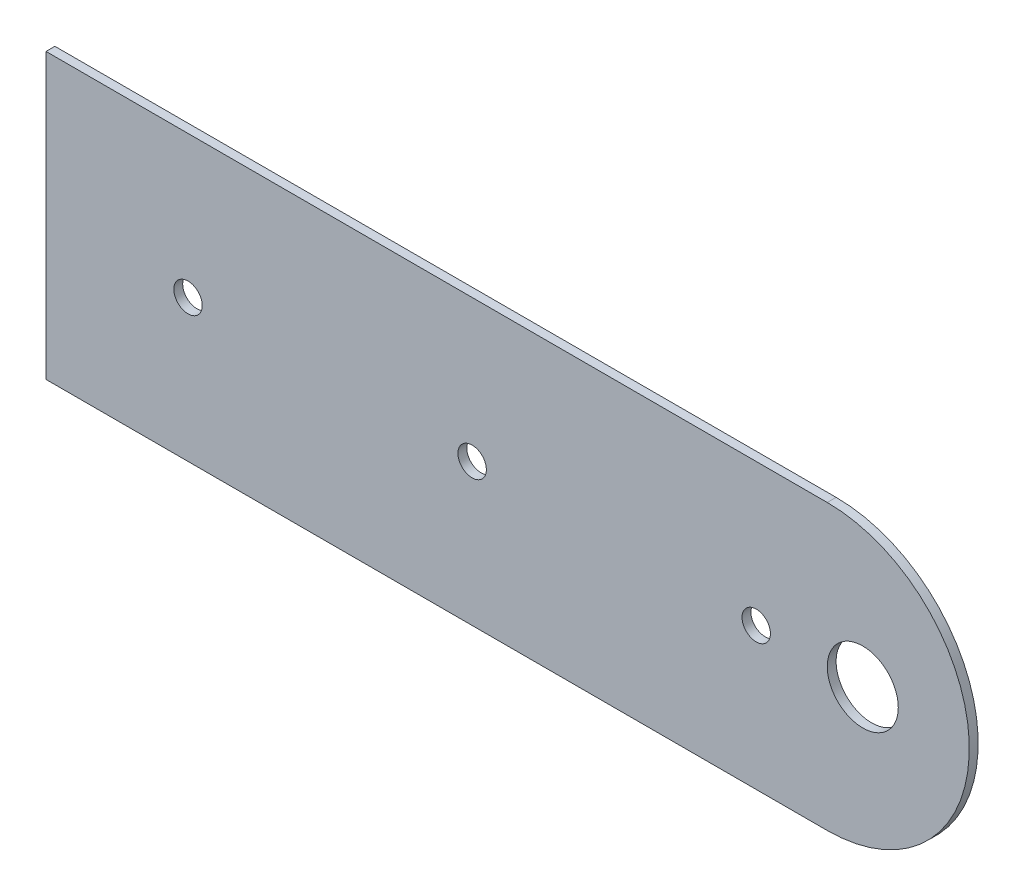
ISO-10303-21;
HEADER;
FILE_DESCRIPTION(('STEP AP214'),'2;1');
FILE_NAME('part.step','',(''),(''),'','','');
FILE_SCHEMA(('AUTOMOTIVE_DESIGN { 1 0 10303 214 1 1 1 1 }'));
ENDSEC;
DATA;
#1=APPLICATION_CONTEXT('core data for automotive mechanical design processes');
#2=APPLICATION_PROTOCOL_DEFINITION('international standard','automotive_design',2000,#1);
#3=PRODUCT_CONTEXT('',#1,'mechanical');
#4=PRODUCT('Part','Part','',(#3));
#5=PRODUCT_RELATED_PRODUCT_CATEGORY('part','',(#4));
#6=PRODUCT_DEFINITION_FORMATION('','',#4);
#7=PRODUCT_DEFINITION_CONTEXT('part definition',#1,'design');
#8=PRODUCT_DEFINITION('design','',#6,#7);
#9=PRODUCT_DEFINITION_SHAPE('','',#8);
#10=(LENGTH_UNIT() NAMED_UNIT(*) SI_UNIT(.MILLI.,.METRE.));
#11=(NAMED_UNIT(*) PLANE_ANGLE_UNIT() SI_UNIT($,.RADIAN.));
#12=(NAMED_UNIT(*) SI_UNIT($,.STERADIAN.) SOLID_ANGLE_UNIT());
#13=UNCERTAINTY_MEASURE_WITH_UNIT(LENGTH_MEASURE(1.E-05),#10,'distance_accuracy_value','');
#14=(GEOMETRIC_REPRESENTATION_CONTEXT(3) GLOBAL_UNCERTAINTY_ASSIGNED_CONTEXT((#13)) GLOBAL_UNIT_ASSIGNED_CONTEXT((#10,
#11,#12)) REPRESENTATION_CONTEXT('',''));
#15=CARTESIAN_POINT('',(0.,0.,0.));
#16=DIRECTION('',(0.,0.,1.));
#17=DIRECTION('',(1.,0.,0.));
#18=AXIS2_PLACEMENT_3D('',#15,#16,#17);
#19=CARTESIAN_POINT('',(139.7,25.4,1.5875));
#20=DIRECTION('',(0.,0.,-1.));
#21=DIRECTION('',(-1.,0.,0.));
#22=AXIS2_PLACEMENT_3D('',#19,#20,#21);
#23=PLANE('',#22);
#24=DIRECTION('',(0.,-1.,0.));
#25=VECTOR('',#24,1.);
#26=CARTESIAN_POINT('',(0.,0.,1.5875));
#27=LINE('',#26,#25);
#28=CARTESIAN_POINT('',(0.,50.8,1.5875));
#29=VERTEX_POINT('',#28);
#30=CARTESIAN_POINT('',(0.,0.,1.5875));
#31=VERTEX_POINT('',#30);
#32=EDGE_CURVE('E86',#29,#31,#27,.T.);
#33=ORIENTED_EDGE('',*,*,#32,.T.);
#34=DIRECTION('',(1.,0.,0.));
#35=VECTOR('',#34,1.);
#36=CARTESIAN_POINT('',(0.,0.,1.5875));
#37=LINE('',#36,#35);
#38=CARTESIAN_POINT('',(139.7,0.,1.5875));
#39=VERTEX_POINT('',#38);
#40=EDGE_CURVE('E81',#31,#39,#37,.T.);
#41=ORIENTED_EDGE('',*,*,#40,.T.);
#42=CARTESIAN_POINT('',(139.7,25.4,1.5875));
#43=DIRECTION('',(0.,0.,1.));
#44=DIRECTION('',(-1.,0.,0.));
#45=AXIS2_PLACEMENT_3D('',#42,#43,#44);
#46=CIRCLE('',#45,25.4);
#47=CARTESIAN_POINT('',(139.7,50.8,1.5875));
#48=VERTEX_POINT('',#47);
#49=EDGE_CURVE('E84',#39,#48,#46,.T.);
#50=ORIENTED_EDGE('',*,*,#49,.T.);
#51=DIRECTION('',(-1.,0.,0.));
#52=VECTOR('',#51,1.);
#53=CARTESIAN_POINT('',(0.,50.8,1.5875));
#54=LINE('',#53,#52);
#55=EDGE_CURVE('E51',#48,#29,#54,.T.);
#56=ORIENTED_EDGE('',*,*,#55,.T.);
#57=EDGE_LOOP('',(#33,#41,#50,#56));
#58=FACE_BOUND('',#57,.T.);
#59=CARTESIAN_POINT('',(146.05,25.4,1.5875));
#60=DIRECTION('',(0.,0.,1.));
#61=DIRECTION('',(1.,0.,0.));
#62=AXIS2_PLACEMENT_3D('',#59,#60,#61);
#63=CIRCLE('',#62,6.35);
#64=CARTESIAN_POINT('',(152.4,25.4,1.5875));
#65=VERTEX_POINT('',#64);
#66=EDGE_CURVE('E101',#65,#65,#63,.T.);
#67=ORIENTED_EDGE('',*,*,#66,.F.);
#68=EDGE_LOOP('',(#67));
#69=FACE_BOUND('',#68,.T.);
#70=CARTESIAN_POINT('',(76.2,25.4,1.5875));
#71=DIRECTION('',(0.,0.,1.));
#72=DIRECTION('',(1.,0.,0.));
#73=AXIS2_PLACEMENT_3D('',#70,#71,#72);
#74=CIRCLE('',#73,2.54);
#75=CARTESIAN_POINT('',(78.74,25.4,1.5875));
#76=VERTEX_POINT('',#75);
#77=EDGE_CURVE('E116',#76,#76,#74,.T.);
#78=ORIENTED_EDGE('',*,*,#77,.F.);
#79=EDGE_LOOP('',(#78));
#80=FACE_BOUND('',#79,.T.);
#81=CARTESIAN_POINT('',(25.4,25.4,1.5875));
#82=DIRECTION('',(0.,0.,1.));
#83=DIRECTION('',(1.,0.,0.));
#84=AXIS2_PLACEMENT_3D('',#81,#82,#83);
#85=CIRCLE('',#84,2.54);
#86=CARTESIAN_POINT('',(27.94,25.4,1.5875));
#87=VERTEX_POINT('',#86);
#88=EDGE_CURVE('E122',#87,#87,#85,.T.);
#89=ORIENTED_EDGE('',*,*,#88,.F.);
#90=EDGE_LOOP('',(#89));
#91=FACE_BOUND('',#90,.T.);
#92=CARTESIAN_POINT('',(127.,25.4,1.5875));
#93=DIRECTION('',(0.,0.,1.));
#94=DIRECTION('',(1.,0.,0.));
#95=AXIS2_PLACEMENT_3D('',#92,#93,#94);
#96=CIRCLE('',#95,2.53999999999998);
#97=CARTESIAN_POINT('',(129.54,25.4,1.5875));
#98=VERTEX_POINT('',#97);
#99=EDGE_CURVE('E128',#98,#98,#96,.T.);
#100=ORIENTED_EDGE('',*,*,#99,.F.);
#101=EDGE_LOOP('',(#100));
#102=FACE_BOUND('',#101,.T.);
#103=ADVANCED_FACE('F34',(#58,#69,#80,#91,#102),#23,.F.);
#104=CARTESIAN_POINT('',(139.7,25.4,0.));
#105=DIRECTION('',(0.,0.,-1.));
#106=DIRECTION('',(-1.,0.,0.));
#107=AXIS2_PLACEMENT_3D('',#104,#105,#106);
#108=PLANE('',#107);
#109=CARTESIAN_POINT('',(25.4,25.4,0.));
#110=DIRECTION('',(0.,0.,1.));
#111=DIRECTION('',(1.,0.,0.));
#112=AXIS2_PLACEMENT_3D('',#109,#110,#111);
#113=CIRCLE('',#112,2.54);
#114=CARTESIAN_POINT('',(27.94,25.4,0.));
#115=VERTEX_POINT('',#114);
#116=EDGE_CURVE('E125',#115,#115,#113,.T.);
#117=ORIENTED_EDGE('',*,*,#116,.T.);
#118=EDGE_LOOP('',(#117));
#119=FACE_BOUND('',#118,.T.);
#120=CARTESIAN_POINT('',(146.05,25.4,0.));
#121=DIRECTION('',(0.,0.,1.));
#122=DIRECTION('',(1.,0.,0.));
#123=AXIS2_PLACEMENT_3D('',#120,#121,#122);
#124=CIRCLE('',#123,6.35);
#125=CARTESIAN_POINT('',(152.4,25.4,0.));
#126=VERTEX_POINT('',#125);
#127=EDGE_CURVE('E113',#126,#126,#124,.T.);
#128=ORIENTED_EDGE('',*,*,#127,.T.);
#129=EDGE_LOOP('',(#128));
#130=FACE_BOUND('',#129,.T.);
#131=DIRECTION('',(0.,-1.,0.));
#132=VECTOR('',#131,1.);
#133=CARTESIAN_POINT('',(0.,0.,0.));
#134=LINE('',#133,#132);
#135=CARTESIAN_POINT('',(0.,50.8,0.));
#136=VERTEX_POINT('',#135);
#137=CARTESIAN_POINT('',(0.,0.,0.));
#138=VERTEX_POINT('',#137);
#139=EDGE_CURVE('E98',#136,#138,#134,.T.);
#140=ORIENTED_EDGE('',*,*,#139,.F.);
#141=DIRECTION('',(-1.,0.,0.));
#142=VECTOR('',#141,1.);
#143=CARTESIAN_POINT('',(0.,50.8,0.));
#144=LINE('',#143,#142);
#145=CARTESIAN_POINT('',(139.7,50.8,0.));
#146=VERTEX_POINT('',#145);
#147=EDGE_CURVE('E74',#146,#136,#144,.T.);
#148=ORIENTED_EDGE('',*,*,#147,.F.);
#149=CARTESIAN_POINT('',(139.7,25.4,0.));
#150=DIRECTION('',(0.,0.,1.));
#151=DIRECTION('',(-1.,0.,0.));
#152=AXIS2_PLACEMENT_3D('',#149,#150,#151);
#153=CIRCLE('',#152,25.4);
#154=CARTESIAN_POINT('',(139.7,0.,0.));
#155=VERTEX_POINT('',#154);
#156=EDGE_CURVE('E68',#155,#146,#153,.T.);
#157=ORIENTED_EDGE('',*,*,#156,.F.);
#158=DIRECTION('',(1.,0.,0.));
#159=VECTOR('',#158,1.);
#160=CARTESIAN_POINT('',(0.,0.,0.));
#161=LINE('',#160,#159);
#162=EDGE_CURVE('E90',#138,#155,#161,.T.);
#163=ORIENTED_EDGE('',*,*,#162,.F.);
#164=EDGE_LOOP('',(#140,#148,#157,#163));
#165=FACE_BOUND('',#164,.T.);
#166=CARTESIAN_POINT('',(76.2,25.4,0.));
#167=DIRECTION('',(0.,0.,1.));
#168=DIRECTION('',(1.,0.,0.));
#169=AXIS2_PLACEMENT_3D('',#166,#167,#168);
#170=CIRCLE('',#169,2.54);
#171=CARTESIAN_POINT('',(78.74,25.4,0.));
#172=VERTEX_POINT('',#171);
#173=EDGE_CURVE('E119',#172,#172,#170,.T.);
#174=ORIENTED_EDGE('',*,*,#173,.T.);
#175=EDGE_LOOP('',(#174));
#176=FACE_BOUND('',#175,.T.);
#177=CARTESIAN_POINT('',(127.,25.4,0.));
#178=DIRECTION('',(0.,0.,1.));
#179=DIRECTION('',(1.,0.,0.));
#180=AXIS2_PLACEMENT_3D('',#177,#178,#179);
#181=CIRCLE('',#180,2.53999999999998);
#182=CARTESIAN_POINT('',(129.54,25.4,0.));
#183=VERTEX_POINT('',#182);
#184=EDGE_CURVE('E131',#183,#183,#181,.T.);
#185=ORIENTED_EDGE('',*,*,#184,.T.);
#186=EDGE_LOOP('',(#185));
#187=FACE_BOUND('',#186,.T.);
#188=ADVANCED_FACE('F109',(#119,#130,#165,#176,#187),#108,.T.);
#189=CARTESIAN_POINT('',(0.,0.,1.5875));
#190=DIRECTION('',(1.,0.,0.));
#191=DIRECTION('',(0.,0.,-1.));
#192=AXIS2_PLACEMENT_3D('',#189,#190,#191);
#193=PLANE('',#192);
#194=ORIENTED_EDGE('',*,*,#139,.T.);
#195=DIRECTION('',(0.,0.,-1.));
#196=VECTOR('',#195,1.);
#197=CARTESIAN_POINT('',(0.,0.,1.5875));
#198=LINE('',#197,#196);
#199=EDGE_CURVE('E11',#31,#138,#198,.T.);
#200=ORIENTED_EDGE('',*,*,#199,.F.);
#201=ORIENTED_EDGE('',*,*,#32,.F.);
#202=DIRECTION('',(0.,0.,-1.));
#203=VECTOR('',#202,1.);
#204=CARTESIAN_POINT('',(0.,50.8,1.5875));
#205=LINE('',#204,#203);
#206=EDGE_CURVE('E94',#29,#136,#205,.T.);
#207=ORIENTED_EDGE('',*,*,#206,.T.);
#208=EDGE_LOOP('',(#194,#200,#201,#207));
#209=FACE_BOUND('',#208,.T.);
#210=ADVANCED_FACE('F36',(#209),#193,.F.);
#211=CARTESIAN_POINT('',(0.,0.,1.5875));
#212=DIRECTION('',(0.,1.,0.));
#213=DIRECTION('',(0.,0.,1.));
#214=AXIS2_PLACEMENT_3D('',#211,#212,#213);
#215=PLANE('',#214);
#216=ORIENTED_EDGE('',*,*,#162,.T.);
#217=DIRECTION('',(0.,0.,-1.));
#218=VECTOR('',#217,1.);
#219=CARTESIAN_POINT('',(139.7,0.,1.5875));
#220=LINE('',#219,#218);
#221=EDGE_CURVE('E43',#39,#155,#220,.T.);
#222=ORIENTED_EDGE('',*,*,#221,.F.);
#223=ORIENTED_EDGE('',*,*,#40,.F.);
#224=ORIENTED_EDGE('',*,*,#199,.T.);
#225=EDGE_LOOP('',(#216,#222,#223,#224));
#226=FACE_BOUND('',#225,.T.);
#227=ADVANCED_FACE('F89',(#226),#215,.F.);
#228=CARTESIAN_POINT('',(139.7,25.4,1.5875));
#229=DIRECTION('',(0.,0.,-1.));
#230=DIRECTION('',(-1.,0.,0.));
#231=AXIS2_PLACEMENT_3D('',#228,#229,#230);
#232=CYLINDRICAL_SURFACE('',#231,25.4);
#233=ORIENTED_EDGE('',*,*,#156,.T.);
#234=DIRECTION('',(0.,0.,-1.));
#235=VECTOR('',#234,1.);
#236=CARTESIAN_POINT('',(139.7,50.8,1.5875));
#237=LINE('',#236,#235);
#238=EDGE_CURVE('E91',#48,#146,#237,.T.);
#239=ORIENTED_EDGE('',*,*,#238,.F.);
#240=ORIENTED_EDGE('',*,*,#49,.F.);
#241=ORIENTED_EDGE('',*,*,#221,.T.);
#242=EDGE_LOOP('',(#233,#239,#240,#241));
#243=FACE_BOUND('',#242,.T.);
#244=ADVANCED_FACE('F92',(#243),#232,.T.);
#245=CARTESIAN_POINT('',(0.,50.8,1.5875));
#246=DIRECTION('',(0.,-1.,0.));
#247=DIRECTION('',(0.,0.,-1.));
#248=AXIS2_PLACEMENT_3D('',#245,#246,#247);
#249=PLANE('',#248);
#250=ORIENTED_EDGE('',*,*,#147,.T.);
#251=ORIENTED_EDGE('',*,*,#206,.F.);
#252=ORIENTED_EDGE('',*,*,#55,.F.);
#253=ORIENTED_EDGE('',*,*,#238,.T.);
#254=EDGE_LOOP('',(#250,#251,#252,#253));
#255=FACE_BOUND('',#254,.T.);
#256=ADVANCED_FACE('F106',(#255),#249,.F.);
#257=CARTESIAN_POINT('',(146.05,25.4,1.5875));
#258=DIRECTION('',(0.,0.,-1.));
#259=DIRECTION('',(-1.,0.,0.));
#260=AXIS2_PLACEMENT_3D('',#257,#258,#259);
#261=CYLINDRICAL_SURFACE('',#260,6.35);
#262=ORIENTED_EDGE('',*,*,#66,.T.);
#263=EDGE_LOOP('',(#262));
#264=FACE_BOUND('',#263,.T.);
#265=ORIENTED_EDGE('',*,*,#127,.F.);
#266=EDGE_LOOP('',(#265));
#267=FACE_BOUND('',#266,.T.);
#268=ADVANCED_FACE('F148',(#264,#267),#261,.F.);
#269=CARTESIAN_POINT('',(76.2,25.4,1.5875));
#270=DIRECTION('',(0.,0.,-1.));
#271=DIRECTION('',(-1.,0.,0.));
#272=AXIS2_PLACEMENT_3D('',#269,#270,#271);
#273=CYLINDRICAL_SURFACE('',#272,2.54);
#274=ORIENTED_EDGE('',*,*,#77,.T.);
#275=EDGE_LOOP('',(#274));
#276=FACE_BOUND('',#275,.T.);
#277=ORIENTED_EDGE('',*,*,#173,.F.);
#278=EDGE_LOOP('',(#277));
#279=FACE_BOUND('',#278,.T.);
#280=ADVANCED_FACE('F194',(#276,#279),#273,.F.);
#281=CARTESIAN_POINT('',(25.4,25.4,1.5875));
#282=DIRECTION('',(0.,0.,-1.));
#283=DIRECTION('',(-1.,0.,0.));
#284=AXIS2_PLACEMENT_3D('',#281,#282,#283);
#285=CYLINDRICAL_SURFACE('',#284,2.54);
#286=ORIENTED_EDGE('',*,*,#88,.T.);
#287=EDGE_LOOP('',(#286));
#288=FACE_BOUND('',#287,.T.);
#289=ORIENTED_EDGE('',*,*,#116,.F.);
#290=EDGE_LOOP('',(#289));
#291=FACE_BOUND('',#290,.T.);
#292=ADVANCED_FACE('F202',(#288,#291),#285,.F.);
#293=CARTESIAN_POINT('',(127.,25.4,1.5875));
#294=DIRECTION('',(0.,0.,-1.));
#295=DIRECTION('',(-1.,0.,0.));
#296=AXIS2_PLACEMENT_3D('',#293,#294,#295);
#297=CYLINDRICAL_SURFACE('',#296,2.53999999999998);
#298=ORIENTED_EDGE('',*,*,#99,.T.);
#299=EDGE_LOOP('',(#298));
#300=FACE_BOUND('',#299,.T.);
#301=ORIENTED_EDGE('',*,*,#184,.F.);
#302=EDGE_LOOP('',(#301));
#303=FACE_BOUND('',#302,.T.);
#304=ADVANCED_FACE('F137',(#300,#303),#297,.F.);
#305=CLOSED_SHELL('',(#103,#188,#210,#227,#244,#256,#268,#280,#292,#304));
#306=MANIFOLD_SOLID_BREP('B2',#305);
#307=ADVANCED_BREP_SHAPE_REPRESENTATION('',(#18,#306),#14);
#308=SHAPE_DEFINITION_REPRESENTATION(#9,#307);
ENDSEC;
END-ISO-10303-21;
